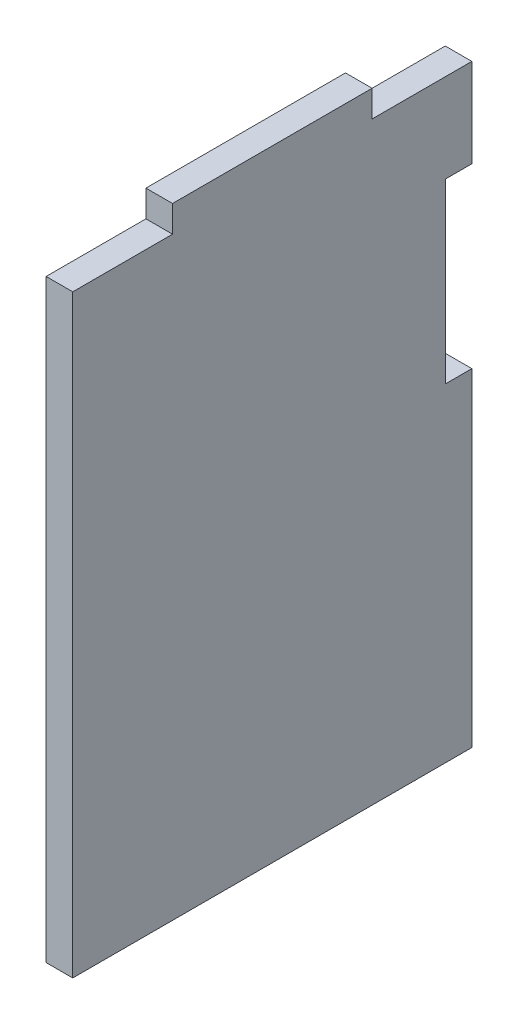
ISO-10303-21;
HEADER;
FILE_DESCRIPTION(('STEP AP214'),'2;1');
FILE_NAME('part.step','',(''),(''),'','','');
FILE_SCHEMA(('AUTOMOTIVE_DESIGN { 1 0 10303 214 1 1 1 1 }'));
ENDSEC;
DATA;
#1=APPLICATION_CONTEXT('core data for automotive mechanical design processes');
#2=APPLICATION_PROTOCOL_DEFINITION('international standard','automotive_design',2000,#1);
#3=PRODUCT_CONTEXT('',#1,'mechanical');
#4=PRODUCT('Part','Part','',(#3));
#5=PRODUCT_RELATED_PRODUCT_CATEGORY('part','',(#4));
#6=PRODUCT_DEFINITION_FORMATION('','',#4);
#7=PRODUCT_DEFINITION_CONTEXT('part definition',#1,'design');
#8=PRODUCT_DEFINITION('design','',#6,#7);
#9=PRODUCT_DEFINITION_SHAPE('','',#8);
#10=(LENGTH_UNIT() NAMED_UNIT(*) SI_UNIT(.MILLI.,.METRE.));
#11=(NAMED_UNIT(*) PLANE_ANGLE_UNIT() SI_UNIT($,.RADIAN.));
#12=(NAMED_UNIT(*) SI_UNIT($,.STERADIAN.) SOLID_ANGLE_UNIT());
#13=UNCERTAINTY_MEASURE_WITH_UNIT(LENGTH_MEASURE(1.E-05),#10,'distance_accuracy_value','');
#14=(GEOMETRIC_REPRESENTATION_CONTEXT(3) GLOBAL_UNCERTAINTY_ASSIGNED_CONTEXT((#13)) GLOBAL_UNIT_ASSIGNED_CONTEXT((#10,
#11,#12)) REPRESENTATION_CONTEXT('',''));
#15=CARTESIAN_POINT('',(0.,0.,0.));
#16=DIRECTION('',(0.,0.,1.));
#17=DIRECTION('',(1.,0.,0.));
#18=AXIS2_PLACEMENT_3D('',#15,#16,#17);
#19=CARTESIAN_POINT('',(3.,0.,-45.));
#20=DIRECTION('',(0.,0.,1.));
#21=DIRECTION('',(1.,0.,0.));
#22=AXIS2_PLACEMENT_3D('',#19,#20,#21);
#23=PLANE('',#22);
#24=DIRECTION('',(0.,1.,0.));
#25=VECTOR('',#24,1.);
#26=CARTESIAN_POINT('',(0.,0.,-45.));
#27=LINE('',#26,#25);
#28=CARTESIAN_POINT('',(0.,0.,-45.));
#29=VERTEX_POINT('',#28);
#30=CARTESIAN_POINT('',(0.,37.,-45.));
#31=VERTEX_POINT('',#30);
#32=EDGE_CURVE('E163',#29,#31,#27,.T.);
#33=ORIENTED_EDGE('',*,*,#32,.T.);
#34=DIRECTION('',(1.,0.,0.));
#35=VECTOR('',#34,1.);
#36=CARTESIAN_POINT('',(-7.,37.,-45.));
#37=LINE('',#36,#35);
#38=CARTESIAN_POINT('',(3.,37.,-45.));
#39=VERTEX_POINT('',#38);
#40=EDGE_CURVE('E129',#31,#39,#37,.T.);
#41=ORIENTED_EDGE('',*,*,#40,.T.);
#42=DIRECTION('',(0.,1.,0.));
#43=VECTOR('',#42,1.);
#44=CARTESIAN_POINT('',(3.,0.,-45.));
#45=LINE('',#44,#43);
#46=CARTESIAN_POINT('',(3.,0.,-45.));
#47=VERTEX_POINT('',#46);
#48=EDGE_CURVE('E147',#47,#39,#45,.T.);
#49=ORIENTED_EDGE('',*,*,#48,.F.);
#50=DIRECTION('',(-1.,0.,0.));
#51=VECTOR('',#50,1.);
#52=CARTESIAN_POINT('',(3.,0.,-45.));
#53=LINE('',#52,#51);
#54=EDGE_CURVE('E146',#47,#29,#53,.T.);
#55=ORIENTED_EDGE('',*,*,#54,.T.);
#56=EDGE_LOOP('',(#33,#41,#49,#55));
#57=FACE_BOUND('',#56,.T.);
#58=ADVANCED_FACE('F33',(#57),#23,.F.);
#59=CARTESIAN_POINT('',(3.,0.,0.));
#60=DIRECTION('',(0.,0.,-1.));
#61=DIRECTION('',(-1.,0.,0.));
#62=AXIS2_PLACEMENT_3D('',#59,#60,#61);
#63=PLANE('',#62);
#64=DIRECTION('',(0.,-1.,0.));
#65=VECTOR('',#64,1.);
#66=CARTESIAN_POINT('',(3.,0.,0.));
#67=LINE('',#66,#65);
#68=CARTESIAN_POINT('',(3.,67.,0.));
#69=VERTEX_POINT('',#68);
#70=CARTESIAN_POINT('',(3.,0.,0.));
#71=VERTEX_POINT('',#70);
#72=EDGE_CURVE('E166',#69,#71,#67,.T.);
#73=ORIENTED_EDGE('',*,*,#72,.F.);
#74=DIRECTION('',(1.,0.,0.));
#75=VECTOR('',#74,1.);
#76=CARTESIAN_POINT('',(-7.,67.,0.));
#77=LINE('',#76,#75);
#78=CARTESIAN_POINT('',(0.,67.,0.));
#79=VERTEX_POINT('',#78);
#80=EDGE_CURVE('E139',#79,#69,#77,.T.);
#81=ORIENTED_EDGE('',*,*,#80,.F.);
#82=DIRECTION('',(0.,-1.,0.));
#83=VECTOR('',#82,1.);
#84=CARTESIAN_POINT('',(0.,0.,0.));
#85=LINE('',#84,#83);
#86=CARTESIAN_POINT('',(0.,0.,0.));
#87=VERTEX_POINT('',#86);
#88=EDGE_CURVE('E157',#79,#87,#85,.T.);
#89=ORIENTED_EDGE('',*,*,#88,.T.);
#90=DIRECTION('',(-1.,0.,0.));
#91=VECTOR('',#90,1.);
#92=CARTESIAN_POINT('',(3.,0.,0.));
#93=LINE('',#92,#91);
#94=EDGE_CURVE('E150',#71,#87,#93,.T.);
#95=ORIENTED_EDGE('',*,*,#94,.F.);
#96=EDGE_LOOP('',(#73,#81,#89,#95));
#97=FACE_BOUND('',#96,.T.);
#98=ADVANCED_FACE('F35',(#97),#63,.F.);
#99=CARTESIAN_POINT('',(3.,0.,0.));
#100=DIRECTION('',(0.,1.,0.));
#101=DIRECTION('',(0.,0.,1.));
#102=AXIS2_PLACEMENT_3D('',#99,#100,#101);
#103=PLANE('',#102);
#104=DIRECTION('',(0.,0.,-1.));
#105=VECTOR('',#104,1.);
#106=CARTESIAN_POINT('',(0.,0.,0.));
#107=LINE('',#106,#105);
#108=EDGE_CURVE('E159',#87,#29,#107,.T.);
#109=ORIENTED_EDGE('',*,*,#108,.T.);
#110=ORIENTED_EDGE('',*,*,#54,.F.);
#111=DIRECTION('',(0.,0.,-1.));
#112=VECTOR('',#111,1.);
#113=CARTESIAN_POINT('',(3.,0.,0.));
#114=LINE('',#113,#112);
#115=EDGE_CURVE('E197',#71,#47,#114,.T.);
#116=ORIENTED_EDGE('',*,*,#115,.F.);
#117=ORIENTED_EDGE('',*,*,#94,.T.);
#118=EDGE_LOOP('',(#109,#110,#116,#117));
#119=FACE_BOUND('',#118,.T.);
#120=ADVANCED_FACE('F196',(#119),#103,.F.);
#121=CARTESIAN_POINT('',(3.,57.,-45.));
#122=VERTEX_POINT('',#121);
#123=CARTESIAN_POINT('',(3.,67.,-45.));
#124=VERTEX_POINT('',#123);
#125=EDGE_CURVE('E153',#122,#124,#45,.T.);
#126=ORIENTED_EDGE('',*,*,#125,.F.);
#127=DIRECTION('',(1.,0.,0.));
#128=VECTOR('',#127,1.);
#129=CARTESIAN_POINT('',(-7.,57.,-45.));
#130=LINE('',#129,#128);
#131=CARTESIAN_POINT('',(0.,57.,-45.));
#132=VERTEX_POINT('',#131);
#133=EDGE_CURVE('E211',#132,#122,#130,.T.);
#134=ORIENTED_EDGE('',*,*,#133,.F.);
#135=CARTESIAN_POINT('',(0.,67.,-45.));
#136=VERTEX_POINT('',#135);
#137=EDGE_CURVE('E162',#132,#136,#27,.T.);
#138=ORIENTED_EDGE('',*,*,#137,.T.);
#139=DIRECTION('',(1.,0.,0.));
#140=VECTOR('',#139,1.);
#141=CARTESIAN_POINT('',(-7.,67.,-45.));
#142=LINE('',#141,#140);
#143=EDGE_CURVE('E160',#136,#124,#142,.T.);
#144=ORIENTED_EDGE('',*,*,#143,.T.);
#145=EDGE_LOOP('',(#126,#134,#138,#144));
#146=FACE_BOUND('',#145,.T.);
#147=ADVANCED_FACE('F240',(#146),#23,.F.);
#148=CARTESIAN_POINT('',(3.,70.,0.));
#149=DIRECTION('',(0.,-1.,0.));
#150=DIRECTION('',(0.,0.,-1.));
#151=AXIS2_PLACEMENT_3D('',#148,#149,#150);
#152=PLANE('',#151);
#153=DIRECTION('',(0.,0.,1.));
#154=VECTOR('',#153,1.);
#155=CARTESIAN_POINT('',(0.,70.,0.));
#156=LINE('',#155,#154);
#157=CARTESIAN_POINT('',(0.,70.,-33.75));
#158=VERTEX_POINT('',#157);
#159=CARTESIAN_POINT('',(0.,70.,-11.25));
#160=VERTEX_POINT('',#159);
#161=EDGE_CURVE('E138',#158,#160,#156,.T.);
#162=ORIENTED_EDGE('',*,*,#161,.T.);
#163=DIRECTION('',(1.,0.,0.));
#164=VECTOR('',#163,1.);
#165=CARTESIAN_POINT('',(-7.,70.,-11.25));
#166=LINE('',#165,#164);
#167=CARTESIAN_POINT('',(3.,70.,-11.25));
#168=VERTEX_POINT('',#167);
#169=EDGE_CURVE('E123',#160,#168,#166,.T.);
#170=ORIENTED_EDGE('',*,*,#169,.T.);
#171=DIRECTION('',(0.,0.,1.));
#172=VECTOR('',#171,1.);
#173=CARTESIAN_POINT('',(3.,70.,0.));
#174=LINE('',#173,#172);
#175=CARTESIAN_POINT('',(3.,70.,-33.75));
#176=VERTEX_POINT('',#175);
#177=EDGE_CURVE('E136',#176,#168,#174,.T.);
#178=ORIENTED_EDGE('',*,*,#177,.F.);
#179=DIRECTION('',(1.,0.,0.));
#180=VECTOR('',#179,1.);
#181=CARTESIAN_POINT('',(-7.,70.,-33.75));
#182=LINE('',#181,#180);
#183=EDGE_CURVE('E201',#158,#176,#182,.T.);
#184=ORIENTED_EDGE('',*,*,#183,.F.);
#185=EDGE_LOOP('',(#162,#170,#178,#184));
#186=FACE_BOUND('',#185,.T.);
#187=ADVANCED_FACE('F134',(#186),#152,.F.);
#188=CARTESIAN_POINT('',(3.,0.,0.));
#189=DIRECTION('',(-1.,0.,0.));
#190=DIRECTION('',(0.,0.,1.));
#191=AXIS2_PLACEMENT_3D('',#188,#189,#190);
#192=PLANE('',#191);
#193=ORIENTED_EDGE('',*,*,#177,.T.);
#194=DIRECTION('',(0.,1.,0.));
#195=VECTOR('',#194,1.);
#196=CARTESIAN_POINT('',(3.,67.,-11.25));
#197=LINE('',#196,#195);
#198=CARTESIAN_POINT('',(3.,67.,-11.25));
#199=VERTEX_POINT('',#198);
#200=EDGE_CURVE('E120',#199,#168,#197,.T.);
#201=ORIENTED_EDGE('',*,*,#200,.F.);
#202=DIRECTION('',(0.,0.,-1.));
#203=VECTOR('',#202,1.);
#204=CARTESIAN_POINT('',(3.,67.,-11.25));
#205=LINE('',#204,#203);
#206=EDGE_CURVE('E128',#69,#199,#205,.T.);
#207=ORIENTED_EDGE('',*,*,#206,.F.);
#208=ORIENTED_EDGE('',*,*,#72,.T.);
#209=ORIENTED_EDGE('',*,*,#115,.T.);
#210=ORIENTED_EDGE('',*,*,#48,.T.);
#211=DIRECTION('',(0.,0.,-1.));
#212=VECTOR('',#211,1.);
#213=CARTESIAN_POINT('',(3.,37.,-45.));
#214=LINE('',#213,#212);
#215=CARTESIAN_POINT('',(3.,37.,-42.));
#216=VERTEX_POINT('',#215);
#217=EDGE_CURVE('E213',#216,#39,#214,.T.);
#218=ORIENTED_EDGE('',*,*,#217,.F.);
#219=DIRECTION('',(0.,-1.,0.));
#220=VECTOR('',#219,1.);
#221=CARTESIAN_POINT('',(3.,57.,-42.));
#222=LINE('',#221,#220);
#223=CARTESIAN_POINT('',(3.,57.,-42.));
#224=VERTEX_POINT('',#223);
#225=EDGE_CURVE('E220',#224,#216,#222,.T.);
#226=ORIENTED_EDGE('',*,*,#225,.F.);
#227=DIRECTION('',(0.,0.,1.));
#228=VECTOR('',#227,1.);
#229=CARTESIAN_POINT('',(3.,57.,-45.));
#230=LINE('',#229,#228);
#231=EDGE_CURVE('E223',#122,#224,#230,.T.);
#232=ORIENTED_EDGE('',*,*,#231,.F.);
#233=ORIENTED_EDGE('',*,*,#125,.T.);
#234=DIRECTION('',(0.,0.,-1.));
#235=VECTOR('',#234,1.);
#236=CARTESIAN_POINT('',(3.,67.,-45.));
#237=LINE('',#236,#235);
#238=CARTESIAN_POINT('',(3.,67.,-33.75));
#239=VERTEX_POINT('',#238);
#240=EDGE_CURVE('E204',#239,#124,#237,.T.);
#241=ORIENTED_EDGE('',*,*,#240,.F.);
#242=DIRECTION('',(0.,-1.,0.));
#243=VECTOR('',#242,1.);
#244=CARTESIAN_POINT('',(3.,70.,-33.75));
#245=LINE('',#244,#243);
#246=EDGE_CURVE('E145',#176,#239,#245,.T.);
#247=ORIENTED_EDGE('',*,*,#246,.F.);
#248=EDGE_LOOP('',(#193,#201,#207,#208,#209,#210,#218,#226,#232,#233,#241,#247));
#249=FACE_BOUND('',#248,.T.);
#250=ADVANCED_FACE('F142',(#249),#192,.F.);
#251=CARTESIAN_POINT('',(0.,0.,0.));
#252=DIRECTION('',(-1.,0.,0.));
#253=DIRECTION('',(0.,0.,1.));
#254=AXIS2_PLACEMENT_3D('',#251,#252,#253);
#255=PLANE('',#254);
#256=DIRECTION('',(0.,-1.,0.));
#257=VECTOR('',#256,1.);
#258=CARTESIAN_POINT('',(0.,0.,-11.25));
#259=LINE('',#258,#257);
#260=CARTESIAN_POINT('',(0.,67.,-11.25));
#261=VERTEX_POINT('',#260);
#262=EDGE_CURVE('E11',#160,#261,#259,.T.);
#263=ORIENTED_EDGE('',*,*,#262,.F.);
#264=ORIENTED_EDGE('',*,*,#161,.F.);
#265=DIRECTION('',(0.,1.,0.));
#266=VECTOR('',#265,1.);
#267=CARTESIAN_POINT('',(0.,0.,-33.75));
#268=LINE('',#267,#266);
#269=CARTESIAN_POINT('',(0.,67.,-33.75));
#270=VERTEX_POINT('',#269);
#271=EDGE_CURVE('E170',#270,#158,#268,.T.);
#272=ORIENTED_EDGE('',*,*,#271,.F.);
#273=DIRECTION('',(0.,0.,1.));
#274=VECTOR('',#273,1.);
#275=CARTESIAN_POINT('',(0.,67.,0.));
#276=LINE('',#275,#274);
#277=EDGE_CURVE('E172',#136,#270,#276,.T.);
#278=ORIENTED_EDGE('',*,*,#277,.F.);
#279=ORIENTED_EDGE('',*,*,#137,.F.);
#280=DIRECTION('',(0.,0.,-1.));
#281=VECTOR('',#280,1.);
#282=CARTESIAN_POINT('',(0.,56.9999999999999,1.31838984174237E-13));
#283=LINE('',#282,#281);
#284=CARTESIAN_POINT('',(0.,57.,-42.));
#285=VERTEX_POINT('',#284);
#286=EDGE_CURVE('E175',#285,#132,#283,.T.);
#287=ORIENTED_EDGE('',*,*,#286,.F.);
#288=DIRECTION('',(0.,1.,0.));
#289=VECTOR('',#288,1.);
#290=CARTESIAN_POINT('',(0.,0.,-42.));
#291=LINE('',#290,#289);
#292=CARTESIAN_POINT('',(0.,37.,-42.));
#293=VERTEX_POINT('',#292);
#294=EDGE_CURVE('E177',#293,#285,#291,.T.);
#295=ORIENTED_EDGE('',*,*,#294,.F.);
#296=DIRECTION('',(0.,0.,1.));
#297=VECTOR('',#296,1.);
#298=CARTESIAN_POINT('',(0.,37.,0.));
#299=LINE('',#298,#297);
#300=EDGE_CURVE('E179',#31,#293,#299,.T.);
#301=ORIENTED_EDGE('',*,*,#300,.F.);
#302=ORIENTED_EDGE('',*,*,#32,.F.);
#303=ORIENTED_EDGE('',*,*,#108,.F.);
#304=ORIENTED_EDGE('',*,*,#88,.F.);
#305=DIRECTION('',(0.,0.,1.));
#306=VECTOR('',#305,1.);
#307=CARTESIAN_POINT('',(0.,67.,0.));
#308=LINE('',#307,#306);
#309=EDGE_CURVE('E41',#261,#79,#308,.T.);
#310=ORIENTED_EDGE('',*,*,#309,.F.);
#311=EDGE_LOOP('',(#263,#264,#272,#278,#279,#287,#295,#301,#302,#303,#304,#310));
#312=FACE_BOUND('',#311,.T.);
#313=ADVANCED_FACE('F190',(#312),#255,.T.);
#314=CARTESIAN_POINT('',(-7.,67.,-45.));
#315=DIRECTION('',(0.,-1.,0.));
#316=DIRECTION('',(0.,0.,-1.));
#317=AXIS2_PLACEMENT_3D('',#314,#315,#316);
#318=PLANE('',#317);
#319=ORIENTED_EDGE('',*,*,#277,.T.);
#320=DIRECTION('',(1.,0.,0.));
#321=VECTOR('',#320,1.);
#322=CARTESIAN_POINT('',(-7.,67.,-33.75));
#323=LINE('',#322,#321);
#324=EDGE_CURVE('E203',#270,#239,#323,.T.);
#325=ORIENTED_EDGE('',*,*,#324,.T.);
#326=ORIENTED_EDGE('',*,*,#240,.T.);
#327=ORIENTED_EDGE('',*,*,#143,.F.);
#328=EDGE_LOOP('',(#319,#325,#326,#327));
#329=FACE_BOUND('',#328,.T.);
#330=ADVANCED_FACE('F243',(#329),#318,.F.);
#331=CARTESIAN_POINT('',(-7.,70.,-33.75));
#332=DIRECTION('',(0.,0.,1.));
#333=DIRECTION('',(1.,0.,0.));
#334=AXIS2_PLACEMENT_3D('',#331,#332,#333);
#335=PLANE('',#334);
#336=ORIENTED_EDGE('',*,*,#271,.T.);
#337=ORIENTED_EDGE('',*,*,#183,.T.);
#338=ORIENTED_EDGE('',*,*,#246,.T.);
#339=ORIENTED_EDGE('',*,*,#324,.F.);
#340=EDGE_LOOP('',(#336,#337,#338,#339));
#341=FACE_BOUND('',#340,.T.);
#342=ADVANCED_FACE('F246',(#341),#335,.F.);
#343=CARTESIAN_POINT('',(-7.,37.,-45.));
#344=DIRECTION('',(0.,-1.,0.));
#345=DIRECTION('',(0.,0.,-1.));
#346=AXIS2_PLACEMENT_3D('',#343,#344,#345);
#347=PLANE('',#346);
#348=ORIENTED_EDGE('',*,*,#300,.T.);
#349=DIRECTION('',(1.,0.,0.));
#350=VECTOR('',#349,1.);
#351=CARTESIAN_POINT('',(-7.,37.,-42.));
#352=LINE('',#351,#350);
#353=EDGE_CURVE('E215',#293,#216,#352,.T.);
#354=ORIENTED_EDGE('',*,*,#353,.T.);
#355=ORIENTED_EDGE('',*,*,#217,.T.);
#356=ORIENTED_EDGE('',*,*,#40,.F.);
#357=EDGE_LOOP('',(#348,#354,#355,#356));
#358=FACE_BOUND('',#357,.T.);
#359=ADVANCED_FACE('F248',(#358),#347,.F.);
#360=CARTESIAN_POINT('',(-7.,57.,-42.));
#361=DIRECTION('',(0.,0.,1.));
#362=DIRECTION('',(1.,0.,0.));
#363=AXIS2_PLACEMENT_3D('',#360,#361,#362);
#364=PLANE('',#363);
#365=ORIENTED_EDGE('',*,*,#294,.T.);
#366=DIRECTION('',(1.,0.,0.));
#367=VECTOR('',#366,1.);
#368=CARTESIAN_POINT('',(-7.,57.,-42.));
#369=LINE('',#368,#367);
#370=EDGE_CURVE('E55',#285,#224,#369,.T.);
#371=ORIENTED_EDGE('',*,*,#370,.T.);
#372=ORIENTED_EDGE('',*,*,#225,.T.);
#373=ORIENTED_EDGE('',*,*,#353,.F.);
#374=EDGE_LOOP('',(#365,#371,#372,#373));
#375=FACE_BOUND('',#374,.T.);
#376=ADVANCED_FACE('F234',(#375),#364,.F.);
#377=CARTESIAN_POINT('',(-7.,57.,-45.));
#378=DIRECTION('',(0.,1.,0.));
#379=DIRECTION('',(0.,0.,1.));
#380=AXIS2_PLACEMENT_3D('',#377,#378,#379);
#381=PLANE('',#380);
#382=ORIENTED_EDGE('',*,*,#286,.T.);
#383=ORIENTED_EDGE('',*,*,#133,.T.);
#384=ORIENTED_EDGE('',*,*,#231,.T.);
#385=ORIENTED_EDGE('',*,*,#370,.F.);
#386=EDGE_LOOP('',(#382,#383,#384,#385));
#387=FACE_BOUND('',#386,.T.);
#388=ADVANCED_FACE('F228',(#387),#381,.F.);
#389=CARTESIAN_POINT('',(-7.,67.,-11.25));
#390=DIRECTION('',(0.,0.,-1.));
#391=DIRECTION('',(-1.,0.,0.));
#392=AXIS2_PLACEMENT_3D('',#389,#390,#391);
#393=PLANE('',#392);
#394=ORIENTED_EDGE('',*,*,#262,.T.);
#395=DIRECTION('',(1.,0.,0.));
#396=VECTOR('',#395,1.);
#397=CARTESIAN_POINT('',(-7.,67.,-11.25));
#398=LINE('',#397,#396);
#399=EDGE_CURVE('E48',#261,#199,#398,.T.);
#400=ORIENTED_EDGE('',*,*,#399,.T.);
#401=ORIENTED_EDGE('',*,*,#200,.T.);
#402=ORIENTED_EDGE('',*,*,#169,.F.);
#403=EDGE_LOOP('',(#394,#400,#401,#402));
#404=FACE_BOUND('',#403,.T.);
#405=ADVANCED_FACE('F122',(#404),#393,.F.);
#406=CARTESIAN_POINT('',(-7.,67.,-11.25));
#407=DIRECTION('',(0.,-1.,0.));
#408=DIRECTION('',(0.,0.,-1.));
#409=AXIS2_PLACEMENT_3D('',#406,#407,#408);
#410=PLANE('',#409);
#411=ORIENTED_EDGE('',*,*,#309,.T.);
#412=ORIENTED_EDGE('',*,*,#80,.T.);
#413=ORIENTED_EDGE('',*,*,#206,.T.);
#414=ORIENTED_EDGE('',*,*,#399,.F.);
#415=EDGE_LOOP('',(#411,#412,#413,#414));
#416=FACE_BOUND('',#415,.T.);
#417=ADVANCED_FACE('F182',(#416),#410,.F.);
#418=CLOSED_SHELL('',(#58,#98,#120,#147,#187,#250,#313,#330,#342,#359,#376,#388,#405,#417));
#419=MANIFOLD_SOLID_BREP('B2',#418);
#420=ADVANCED_BREP_SHAPE_REPRESENTATION('',(#18,#419),#14);
#421=SHAPE_DEFINITION_REPRESENTATION(#9,#420);
ENDSEC;
END-ISO-10303-21;
